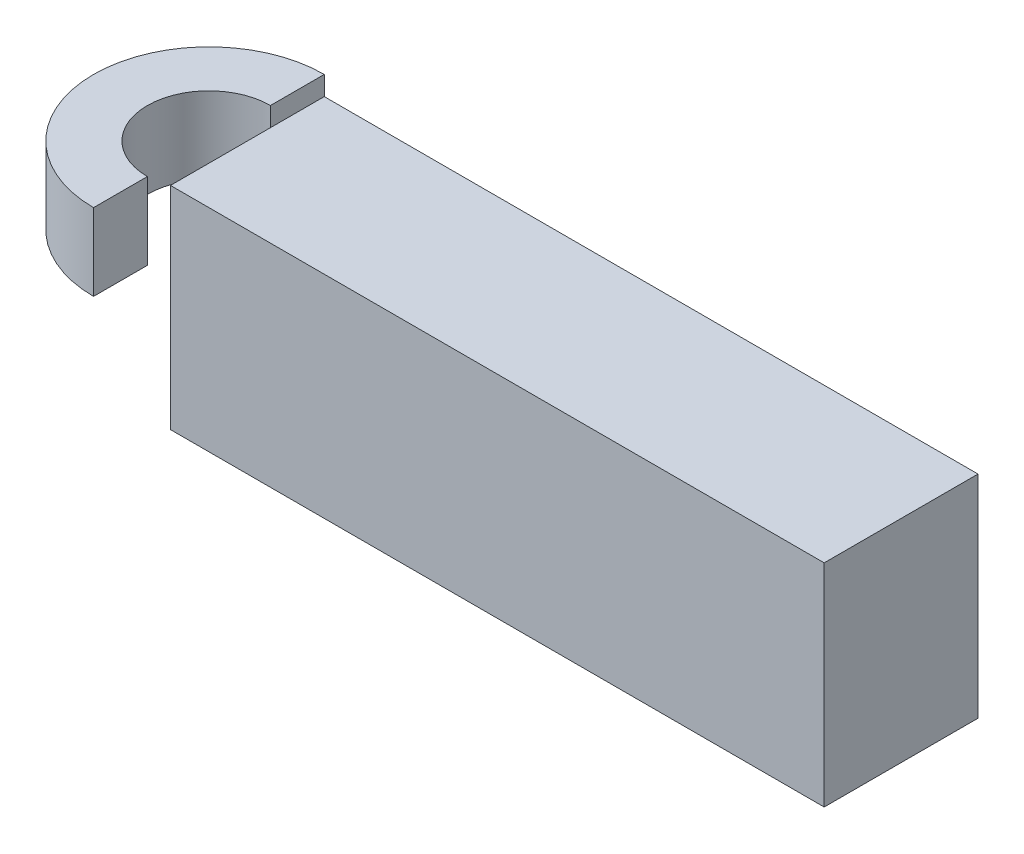
ISO-10303-21;
HEADER;
FILE_DESCRIPTION(('STEP AP214'),'2;1');
FILE_NAME('part.step','',(''),(''),'','','');
FILE_SCHEMA(('AUTOMOTIVE_DESIGN { 1 0 10303 214 1 1 1 1 }'));
ENDSEC;
DATA;
#1=APPLICATION_CONTEXT('core data for automotive mechanical design processes');
#2=APPLICATION_PROTOCOL_DEFINITION('international standard','automotive_design',2000,#1);
#3=PRODUCT_CONTEXT('',#1,'mechanical');
#4=PRODUCT('Part','Part','',(#3));
#5=PRODUCT_RELATED_PRODUCT_CATEGORY('part','',(#4));
#6=PRODUCT_DEFINITION_FORMATION('','',#4);
#7=PRODUCT_DEFINITION_CONTEXT('part definition',#1,'design');
#8=PRODUCT_DEFINITION('design','',#6,#7);
#9=PRODUCT_DEFINITION_SHAPE('','',#8);
#10=(LENGTH_UNIT() NAMED_UNIT(*) SI_UNIT(.MILLI.,.METRE.));
#11=(NAMED_UNIT(*) PLANE_ANGLE_UNIT() SI_UNIT($,.RADIAN.));
#12=(NAMED_UNIT(*) SI_UNIT($,.STERADIAN.) SOLID_ANGLE_UNIT());
#13=UNCERTAINTY_MEASURE_WITH_UNIT(LENGTH_MEASURE(1.E-05),#10,'distance_accuracy_value','');
#14=(GEOMETRIC_REPRESENTATION_CONTEXT(3) GLOBAL_UNCERTAINTY_ASSIGNED_CONTEXT((#13)) GLOBAL_UNIT_ASSIGNED_CONTEXT((#10,
#11,#12)) REPRESENTATION_CONTEXT('',''));
#15=CARTESIAN_POINT('',(0.,0.,0.));
#16=DIRECTION('',(0.,0.,1.));
#17=DIRECTION('',(1.,0.,0.));
#18=AXIS2_PLACEMENT_3D('',#15,#16,#17);
#19=CARTESIAN_POINT('',(0.,34.925,0.));
#20=DIRECTION('',(1.,0.,0.));
#21=DIRECTION('',(0.,0.,-1.));
#22=AXIS2_PLACEMENT_3D('',#19,#20,#21);
#23=PLANE('',#22);
#24=DIRECTION('',(0.,0.,1.));
#25=VECTOR('',#24,1.);
#26=CARTESIAN_POINT('',(0.,34.925,0.));
#27=LINE('',#26,#25);
#28=CARTESIAN_POINT('',(0.,34.925,-16.51));
#29=VERTEX_POINT('',#28);
#30=CARTESIAN_POINT('',(0.,34.925,0.));
#31=VERTEX_POINT('',#30);
#32=EDGE_CURVE('E84',#29,#31,#27,.T.);
#33=ORIENTED_EDGE('',*,*,#32,.F.);
#34=DIRECTION('',(0.,-1.,0.));
#35=VECTOR('',#34,1.);
#36=CARTESIAN_POINT('',(0.,38.1,-16.51));
#37=LINE('',#36,#35);
#38=CARTESIAN_POINT('',(0.,25.4,-16.51));
#39=VERTEX_POINT('',#38);
#40=EDGE_CURVE('E117',#29,#39,#37,.T.);
#41=ORIENTED_EDGE('',*,*,#40,.T.);
#42=DIRECTION('',(0.,0.,1.));
#43=VECTOR('',#42,1.);
#44=CARTESIAN_POINT('',(0.,25.4,0.));
#45=LINE('',#44,#43);
#46=CARTESIAN_POINT('',(0.,25.4,-25.4));
#47=VERTEX_POINT('',#46);
#48=EDGE_CURVE('E188',#47,#39,#45,.T.);
#49=ORIENTED_EDGE('',*,*,#48,.F.);
#50=DIRECTION('',(0.,-1.,0.));
#51=VECTOR('',#50,1.);
#52=CARTESIAN_POINT('',(0.,34.925,-25.4));
#53=LINE('',#52,#51);
#54=CARTESIAN_POINT('',(0.,0.,-25.4));
#55=VERTEX_POINT('',#54);
#56=EDGE_CURVE('E79',#47,#55,#53,.T.);
#57=ORIENTED_EDGE('',*,*,#56,.T.);
#58=DIRECTION('',(0.,0.,1.));
#59=VECTOR('',#58,1.);
#60=CARTESIAN_POINT('',(0.,0.,0.));
#61=LINE('',#60,#59);
#62=CARTESIAN_POINT('',(0.,0.,0.));
#63=VERTEX_POINT('',#62);
#64=EDGE_CURVE('E118',#55,#63,#61,.T.);
#65=ORIENTED_EDGE('',*,*,#64,.T.);
#66=DIRECTION('',(0.,-1.,0.));
#67=VECTOR('',#66,1.);
#68=CARTESIAN_POINT('',(0.,34.925,0.));
#69=LINE('',#68,#67);
#70=EDGE_CURVE('E11',#31,#63,#69,.T.);
#71=ORIENTED_EDGE('',*,*,#70,.F.);
#72=EDGE_LOOP('',(#33,#41,#49,#57,#65,#71));
#73=FACE_BOUND('',#72,.T.);
#74=ADVANCED_FACE('F35',(#73),#23,.F.);
#75=CARTESIAN_POINT('',(0.,34.925,0.));
#76=DIRECTION('',(0.,0.,-1.));
#77=DIRECTION('',(-1.,0.,0.));
#78=AXIS2_PLACEMENT_3D('',#75,#76,#77);
#79=PLANE('',#78);
#80=DIRECTION('',(1.,0.,0.));
#81=VECTOR('',#80,1.);
#82=CARTESIAN_POINT('',(0.,0.,0.));
#83=LINE('',#82,#81);
#84=CARTESIAN_POINT('',(107.95,0.,0.));
#85=VERTEX_POINT('',#84);
#86=EDGE_CURVE('E154',#63,#85,#83,.T.);
#87=ORIENTED_EDGE('',*,*,#86,.T.);
#88=DIRECTION('',(0.,-1.,0.));
#89=VECTOR('',#88,1.);
#90=CARTESIAN_POINT('',(107.95,34.925,0.));
#91=LINE('',#90,#89);
#92=CARTESIAN_POINT('',(107.95,34.925,0.));
#93=VERTEX_POINT('',#92);
#94=EDGE_CURVE('E42',#93,#85,#91,.T.);
#95=ORIENTED_EDGE('',*,*,#94,.F.);
#96=DIRECTION('',(1.,0.,0.));
#97=VECTOR('',#96,1.);
#98=CARTESIAN_POINT('',(0.,34.925,0.));
#99=LINE('',#98,#97);
#100=EDGE_CURVE('E148',#31,#93,#99,.T.);
#101=ORIENTED_EDGE('',*,*,#100,.F.);
#102=ORIENTED_EDGE('',*,*,#70,.T.);
#103=EDGE_LOOP('',(#87,#95,#101,#102));
#104=FACE_BOUND('',#103,.T.);
#105=ADVANCED_FACE('F201',(#104),#79,.F.);
#106=CARTESIAN_POINT('',(107.95,34.925,0.));
#107=DIRECTION('',(-1.,0.,0.));
#108=DIRECTION('',(0.,0.,1.));
#109=AXIS2_PLACEMENT_3D('',#106,#107,#108);
#110=PLANE('',#109);
#111=DIRECTION('',(0.,0.,-1.));
#112=VECTOR('',#111,1.);
#113=CARTESIAN_POINT('',(107.95,0.,0.));
#114=LINE('',#113,#112);
#115=CARTESIAN_POINT('',(107.95,0.,-25.4));
#116=VERTEX_POINT('',#115);
#117=EDGE_CURVE('E156',#85,#116,#114,.T.);
#118=ORIENTED_EDGE('',*,*,#117,.T.);
#119=DIRECTION('',(0.,-1.,0.));
#120=VECTOR('',#119,1.);
#121=CARTESIAN_POINT('',(107.95,34.925,-25.4));
#122=LINE('',#121,#120);
#123=CARTESIAN_POINT('',(107.95,34.925,-25.4));
#124=VERTEX_POINT('',#123);
#125=EDGE_CURVE('E162',#124,#116,#122,.T.);
#126=ORIENTED_EDGE('',*,*,#125,.F.);
#127=DIRECTION('',(0.,0.,-1.));
#128=VECTOR('',#127,1.);
#129=CARTESIAN_POINT('',(107.95,34.925,0.));
#130=LINE('',#129,#128);
#131=EDGE_CURVE('E58',#93,#124,#130,.T.);
#132=ORIENTED_EDGE('',*,*,#131,.F.);
#133=ORIENTED_EDGE('',*,*,#94,.T.);
#134=EDGE_LOOP('',(#118,#126,#132,#133));
#135=FACE_BOUND('',#134,.T.);
#136=ADVANCED_FACE('F168',(#135),#110,.F.);
#137=CARTESIAN_POINT('',(0.,34.925,-25.4));
#138=DIRECTION('',(0.,0.,1.));
#139=DIRECTION('',(1.,0.,0.));
#140=AXIS2_PLACEMENT_3D('',#137,#138,#139);
#141=PLANE('',#140);
#142=DIRECTION('',(-1.,0.,0.));
#143=VECTOR('',#142,1.);
#144=CARTESIAN_POINT('',(0.,0.,-25.4));
#145=LINE('',#144,#143);
#146=EDGE_CURVE('E158',#116,#55,#145,.T.);
#147=ORIENTED_EDGE('',*,*,#146,.T.);
#148=ORIENTED_EDGE('',*,*,#56,.F.);
#149=CARTESIAN_POINT('',(0.,34.925,-25.4));
#150=VERTEX_POINT('',#149);
#151=EDGE_CURVE('E160',#150,#47,#53,.T.);
#152=ORIENTED_EDGE('',*,*,#151,.F.);
#153=DIRECTION('',(-1.,0.,0.));
#154=VECTOR('',#153,1.);
#155=CARTESIAN_POINT('',(0.,34.925,-25.4));
#156=LINE('',#155,#154);
#157=EDGE_CURVE('E151',#124,#150,#156,.T.);
#158=ORIENTED_EDGE('',*,*,#157,.F.);
#159=ORIENTED_EDGE('',*,*,#125,.T.);
#160=EDGE_LOOP('',(#147,#148,#152,#158,#159));
#161=FACE_BOUND('',#160,.T.);
#162=ADVANCED_FACE('F175',(#161),#141,.F.);
#163=CARTESIAN_POINT('',(0.,34.925,0.));
#164=DIRECTION('',(0.,-1.,0.));
#165=DIRECTION('',(0.,0.,-1.));
#166=AXIS2_PLACEMENT_3D('',#163,#164,#165);
#167=PLANE('',#166);
#168=EDGE_CURVE('E146',#150,#29,#27,.T.);
#169=ORIENTED_EDGE('',*,*,#168,.T.);
#170=ORIENTED_EDGE('',*,*,#32,.T.);
#171=ORIENTED_EDGE('',*,*,#100,.T.);
#172=ORIENTED_EDGE('',*,*,#131,.T.);
#173=ORIENTED_EDGE('',*,*,#157,.T.);
#174=EDGE_LOOP('',(#169,#170,#171,#172,#173));
#175=FACE_BOUND('',#174,.T.);
#176=ADVANCED_FACE('F178',(#175),#167,.F.);
#177=CARTESIAN_POINT('',(0.,0.,0.));
#178=DIRECTION('',(0.,-1.,0.));
#179=DIRECTION('',(0.,0.,-1.));
#180=AXIS2_PLACEMENT_3D('',#177,#178,#179);
#181=PLANE('',#180);
#182=ORIENTED_EDGE('',*,*,#64,.F.);
#183=ORIENTED_EDGE('',*,*,#146,.F.);
#184=ORIENTED_EDGE('',*,*,#117,.F.);
#185=ORIENTED_EDGE('',*,*,#86,.F.);
#186=EDGE_LOOP('',(#182,#183,#184,#185));
#187=FACE_BOUND('',#186,.T.);
#188=ADVANCED_FACE('F173',(#187),#181,.T.);
#189=CARTESIAN_POINT('',(0.,38.1,0.));
#190=DIRECTION('',(1.,0.,0.));
#191=DIRECTION('',(0.,0.,-1.));
#192=AXIS2_PLACEMENT_3D('',#189,#190,#191);
#193=PLANE('',#192);
#194=ORIENTED_EDGE('',*,*,#168,.F.);
#195=DIRECTION('',(0.,-1.,0.));
#196=VECTOR('',#195,1.);
#197=CARTESIAN_POINT('',(0.,38.1,-25.4));
#198=LINE('',#197,#196);
#199=CARTESIAN_POINT('',(0.,38.1,-25.4));
#200=VERTEX_POINT('',#199);
#201=EDGE_CURVE('E130',#200,#150,#198,.T.);
#202=ORIENTED_EDGE('',*,*,#201,.F.);
#203=DIRECTION('',(0.,0.,1.));
#204=VECTOR('',#203,1.);
#205=CARTESIAN_POINT('',(0.,38.1,0.));
#206=LINE('',#205,#204);
#207=CARTESIAN_POINT('',(0.,38.1,-16.51));
#208=VERTEX_POINT('',#207);
#209=EDGE_CURVE('E123',#200,#208,#206,.T.);
#210=ORIENTED_EDGE('',*,*,#209,.T.);
#211=EDGE_CURVE('E49',#208,#29,#37,.T.);
#212=ORIENTED_EDGE('',*,*,#211,.T.);
#213=EDGE_LOOP('',(#194,#202,#210,#212));
#214=FACE_BOUND('',#213,.T.);
#215=ADVANCED_FACE('F128',(#214),#193,.T.);
#216=CARTESIAN_POINT('',(0.,38.1,-6.35));
#217=DIRECTION('',(0.,-1.,0.));
#218=DIRECTION('',(0.,0.,-1.));
#219=AXIS2_PLACEMENT_3D('',#216,#217,#218);
#220=CYLINDRICAL_SURFACE('',#219,10.16);
#221=CARTESIAN_POINT('',(0.,25.4,-6.35));
#222=DIRECTION('',(0.,1.,0.));
#223=DIRECTION('',(0.,0.,1.));
#224=AXIS2_PLACEMENT_3D('',#221,#222,#223);
#225=CIRCLE('',#224,10.16);
#226=CARTESIAN_POINT('',(0.,25.4,3.81));
#227=VERTEX_POINT('',#226);
#228=EDGE_CURVE('E191',#39,#227,#225,.T.);
#229=ORIENTED_EDGE('',*,*,#228,.F.);
#230=ORIENTED_EDGE('',*,*,#40,.F.);
#231=ORIENTED_EDGE('',*,*,#211,.F.);
#232=CARTESIAN_POINT('',(0.,38.1,-6.35));
#233=DIRECTION('',(0.,1.,0.));
#234=DIRECTION('',(0.,0.,1.));
#235=AXIS2_PLACEMENT_3D('',#232,#233,#234);
#236=CIRCLE('',#235,10.16);
#237=CARTESIAN_POINT('',(0.,38.1,3.81));
#238=VERTEX_POINT('',#237);
#239=EDGE_CURVE('E114',#208,#238,#236,.T.);
#240=ORIENTED_EDGE('',*,*,#239,.T.);
#241=DIRECTION('',(0.,-1.,0.));
#242=VECTOR('',#241,1.);
#243=CARTESIAN_POINT('',(0.,38.1,3.81));
#244=LINE('',#243,#242);
#245=EDGE_CURVE('E135',#238,#227,#244,.T.);
#246=ORIENTED_EDGE('',*,*,#245,.T.);
#247=EDGE_LOOP('',(#229,#230,#231,#240,#246));
#248=FACE_BOUND('',#247,.T.);
#249=ADVANCED_FACE('F113',(#248),#220,.F.);
#250=CARTESIAN_POINT('',(0.,38.1,-6.35));
#251=DIRECTION('',(0.,-1.,0.));
#252=DIRECTION('',(0.,0.,-1.));
#253=AXIS2_PLACEMENT_3D('',#250,#251,#252);
#254=CYLINDRICAL_SURFACE('',#253,19.05);
#255=CARTESIAN_POINT('',(0.,25.4,-6.35));
#256=DIRECTION('',(0.,1.,0.));
#257=DIRECTION('',(0.,0.,1.));
#258=AXIS2_PLACEMENT_3D('',#255,#256,#257);
#259=CIRCLE('',#258,19.05);
#260=CARTESIAN_POINT('',(0.,25.4,12.7));
#261=VERTEX_POINT('',#260);
#262=EDGE_CURVE('E142',#47,#261,#259,.T.);
#263=ORIENTED_EDGE('',*,*,#262,.T.);
#264=DIRECTION('',(0.,-1.,0.));
#265=VECTOR('',#264,1.);
#266=CARTESIAN_POINT('',(0.,38.1,12.7));
#267=LINE('',#266,#265);
#268=CARTESIAN_POINT('',(0.,38.1,12.7));
#269=VERTEX_POINT('',#268);
#270=EDGE_CURVE('E137',#269,#261,#267,.T.);
#271=ORIENTED_EDGE('',*,*,#270,.F.);
#272=CARTESIAN_POINT('',(0.,38.1,-6.35));
#273=DIRECTION('',(0.,1.,0.));
#274=DIRECTION('',(0.,0.,1.));
#275=AXIS2_PLACEMENT_3D('',#272,#273,#274);
#276=CIRCLE('',#275,19.05);
#277=EDGE_CURVE('E132',#200,#269,#276,.T.);
#278=ORIENTED_EDGE('',*,*,#277,.F.);
#279=ORIENTED_EDGE('',*,*,#201,.T.);
#280=ORIENTED_EDGE('',*,*,#151,.T.);
#281=EDGE_LOOP('',(#263,#271,#278,#279,#280));
#282=FACE_BOUND('',#281,.T.);
#283=ADVANCED_FACE('F181',(#282),#254,.T.);
#284=EDGE_CURVE('E126',#227,#261,#45,.T.);
#285=ORIENTED_EDGE('',*,*,#284,.F.);
#286=ORIENTED_EDGE('',*,*,#245,.F.);
#287=EDGE_CURVE('E125',#238,#269,#206,.T.);
#288=ORIENTED_EDGE('',*,*,#287,.T.);
#289=ORIENTED_EDGE('',*,*,#270,.T.);
#290=EDGE_LOOP('',(#285,#286,#288,#289));
#291=FACE_BOUND('',#290,.T.);
#292=ADVANCED_FACE('F186',(#291),#193,.T.);
#293=CARTESIAN_POINT('',(0.,38.1,0.));
#294=DIRECTION('',(0.,1.,0.));
#295=DIRECTION('',(0.,0.,1.));
#296=AXIS2_PLACEMENT_3D('',#293,#294,#295);
#297=PLANE('',#296);
#298=ORIENTED_EDGE('',*,*,#239,.F.);
#299=ORIENTED_EDGE('',*,*,#209,.F.);
#300=ORIENTED_EDGE('',*,*,#277,.T.);
#301=ORIENTED_EDGE('',*,*,#287,.F.);
#302=EDGE_LOOP('',(#298,#299,#300,#301));
#303=FACE_BOUND('',#302,.T.);
#304=ADVANCED_FACE('F122',(#303),#297,.T.);
#305=CARTESIAN_POINT('',(0.,25.4,0.));
#306=DIRECTION('',(0.,1.,0.));
#307=DIRECTION('',(0.,0.,1.));
#308=AXIS2_PLACEMENT_3D('',#305,#306,#307);
#309=PLANE('',#308);
#310=ORIENTED_EDGE('',*,*,#228,.T.);
#311=ORIENTED_EDGE('',*,*,#284,.T.);
#312=ORIENTED_EDGE('',*,*,#262,.F.);
#313=ORIENTED_EDGE('',*,*,#48,.T.);
#314=EDGE_LOOP('',(#310,#311,#312,#313));
#315=FACE_BOUND('',#314,.T.);
#316=ADVANCED_FACE('F192',(#315),#309,.F.);
#317=CLOSED_SHELL('',(#74,#105,#136,#162,#176,#188,#215,#249,#283,#292,#304,#316));
#318=MANIFOLD_SOLID_BREP('B2',#317);
#319=ADVANCED_BREP_SHAPE_REPRESENTATION('',(#18,#318),#14);
#320=SHAPE_DEFINITION_REPRESENTATION(#9,#319);
ENDSEC;
END-ISO-10303-21;
